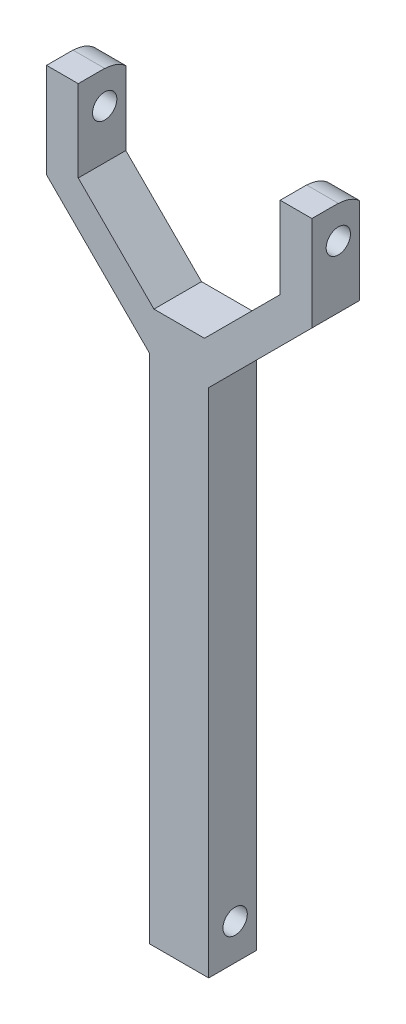
ISO-10303-21;
HEADER;
FILE_DESCRIPTION(('STEP AP214'),'2;1');
FILE_NAME('part.step','',(''),(''),'','','');
FILE_SCHEMA(('AUTOMOTIVE_DESIGN { 1 0 10303 214 1 1 1 1 }'));
ENDSEC;
DATA;
#1=APPLICATION_CONTEXT('core data for automotive mechanical design processes');
#2=APPLICATION_PROTOCOL_DEFINITION('international standard','automotive_design',2000,#1);
#3=PRODUCT_CONTEXT('',#1,'mechanical');
#4=PRODUCT('Part','Part','',(#3));
#5=PRODUCT_RELATED_PRODUCT_CATEGORY('part','',(#4));
#6=PRODUCT_DEFINITION_FORMATION('','',#4);
#7=PRODUCT_DEFINITION_CONTEXT('part definition',#1,'design');
#8=PRODUCT_DEFINITION('design','',#6,#7);
#9=PRODUCT_DEFINITION_SHAPE('','',#8);
#10=(LENGTH_UNIT() NAMED_UNIT(*) SI_UNIT(.MILLI.,.METRE.));
#11=(NAMED_UNIT(*) PLANE_ANGLE_UNIT() SI_UNIT($,.RADIAN.));
#12=(NAMED_UNIT(*) SI_UNIT($,.STERADIAN.) SOLID_ANGLE_UNIT());
#13=UNCERTAINTY_MEASURE_WITH_UNIT(LENGTH_MEASURE(1.E-05),#10,'distance_accuracy_value','');
#14=(GEOMETRIC_REPRESENTATION_CONTEXT(3) GLOBAL_UNCERTAINTY_ASSIGNED_CONTEXT((#13)) GLOBAL_UNIT_ASSIGNED_CONTEXT((#10,
#11,#12)) REPRESENTATION_CONTEXT('',''));
#15=CARTESIAN_POINT('',(0.,0.,0.));
#16=DIRECTION('',(0.,0.,1.));
#17=DIRECTION('',(1.,0.,0.));
#18=AXIS2_PLACEMENT_3D('',#15,#16,#17);
#19=CARTESIAN_POINT('',(11.6757149206511,24.7214625235345,4.5));
#20=DIRECTION('',(-1.,0.,0.));
#21=DIRECTION('',(0.,0.,1.));
#22=AXIS2_PLACEMENT_3D('',#19,#20,#21);
#23=PLANE('',#22);
#24=CARTESIAN_POINT('',(11.6757149206511,30.6105054346153,2.0000002331062));
#25=DIRECTION('',(-1.,0.,0.));
#26=DIRECTION('',(0.,0.,1.));
#27=AXIS2_PLACEMENT_3D('',#24,#25,#26);
#28=CIRCLE('',#27,1.15000000596049);
#29=CARTESIAN_POINT('',(11.6757149206511,30.6105054346153,3.15000023906669));
#30=VERTEX_POINT('',#29);
#31=EDGE_CURVE('E213',#30,#30,#28,.F.);
#32=ORIENTED_EDGE('',*,*,#31,.F.);
#33=EDGE_LOOP('',(#32));
#34=FACE_BOUND('',#33,.T.);
#35=CARTESIAN_POINT('',(11.6757149206511,30.6105054346153,2.00000023310621));
#36=DIRECTION('',(-1.,0.,0.));
#37=DIRECTION('',(0.,0.,1.));
#38=AXIS2_PLACEMENT_3D('',#35,#36,#37);
#39=CIRCLE('',#38,3.05476557348606);
#40=CARTESIAN_POINT('',(11.6757149206511,33.6652710081013,2.0000002331062));
#41=VERTEX_POINT('',#40);
#42=CARTESIAN_POINT('',(11.6757149206511,32.9195294224792,0.));
#43=VERTEX_POINT('',#42);
#44=EDGE_CURVE('E54',#41,#43,#39,.T.);
#45=ORIENTED_EDGE('',*,*,#44,.F.);
#46=DIRECTION('',(0.,-1.,0.));
#47=VECTOR('',#46,1.);
#48=CARTESIAN_POINT('',(11.6757149206511,24.7214625235345,2.0000002331062));
#49=LINE('',#48,#47);
#50=CARTESIAN_POINT('',(11.6757149206511,33.6923255947658,2.0000002331062));
#51=VERTEX_POINT('',#50);
#52=EDGE_CURVE('E165',#51,#41,#49,.T.);
#53=ORIENTED_EDGE('',*,*,#52,.F.);
#54=DIRECTION('',(0.,0.,-1.));
#55=VECTOR('',#54,1.);
#56=CARTESIAN_POINT('',(11.6757149206511,33.6923255947658,4.5));
#57=LINE('',#56,#55);
#58=CARTESIAN_POINT('',(11.6757149206511,33.6923255947658,4.5));
#59=VERTEX_POINT('',#58);
#60=EDGE_CURVE('E338',#59,#51,#57,.T.);
#61=ORIENTED_EDGE('',*,*,#60,.F.);
#62=DIRECTION('',(0.,1.,0.));
#63=VECTOR('',#62,1.);
#64=CARTESIAN_POINT('',(11.6757149206511,24.7214625235345,4.5));
#65=LINE('',#64,#63);
#66=CARTESIAN_POINT('',(11.6757149206511,24.7214625235345,4.5));
#67=VERTEX_POINT('',#66);
#68=EDGE_CURVE('E237',#67,#59,#65,.T.);
#69=ORIENTED_EDGE('',*,*,#68,.F.);
#70=DIRECTION('',(0.,0.,-1.));
#71=VECTOR('',#70,1.);
#72=CARTESIAN_POINT('',(11.6757149206511,24.7214625235345,4.5));
#73=LINE('',#72,#71);
#74=CARTESIAN_POINT('',(11.6757149206511,24.7214625235345,0.));
#75=VERTEX_POINT('',#74);
#76=EDGE_CURVE('E341',#67,#75,#73,.T.);
#77=ORIENTED_EDGE('',*,*,#76,.T.);
#78=DIRECTION('',(0.,1.,0.));
#79=VECTOR('',#78,1.);
#80=CARTESIAN_POINT('',(11.6757149206511,24.7214625235345,0.));
#81=LINE('',#80,#79);
#82=EDGE_CURVE('E187',#75,#43,#81,.T.);
#83=ORIENTED_EDGE('',*,*,#82,.T.);
#84=EDGE_LOOP('',(#45,#53,#61,#69,#77,#83));
#85=FACE_BOUND('',#84,.T.);
#86=ADVANCED_FACE('F38',(#34,#85),#23,.F.);
#87=CARTESIAN_POINT('',(11.6757149206511,33.6923255947658,4.5));
#88=DIRECTION('',(0.,-1.,0.));
#89=DIRECTION('',(0.,0.,-1.));
#90=AXIS2_PLACEMENT_3D('',#87,#88,#89);
#91=PLANE('',#90);
#92=DIRECTION('',(1.,0.,0.));
#93=VECTOR('',#92,1.);
#94=CARTESIAN_POINT('',(11.6757149206511,33.6923255947658,2.0000002331062));
#95=LINE('',#94,#93);
#96=CARTESIAN_POINT('',(8.67571399961199,33.6923255947658,2.0000002331062));
#97=VERTEX_POINT('',#96);
#98=EDGE_CURVE('E170',#97,#51,#95,.T.);
#99=ORIENTED_EDGE('',*,*,#98,.F.);
#100=DIRECTION('',(0.,0.,-1.));
#101=VECTOR('',#100,1.);
#102=CARTESIAN_POINT('',(8.67571399961199,33.6923255947658,4.5));
#103=LINE('',#102,#101);
#104=CARTESIAN_POINT('',(8.67571399961199,33.6923255947658,4.5));
#105=VERTEX_POINT('',#104);
#106=EDGE_CURVE('E334',#105,#97,#103,.T.);
#107=ORIENTED_EDGE('',*,*,#106,.F.);
#108=DIRECTION('',(-1.,0.,0.));
#109=VECTOR('',#108,1.);
#110=CARTESIAN_POINT('',(11.6757149206511,33.6923255947658,4.5));
#111=LINE('',#110,#109);
#112=EDGE_CURVE('E240',#59,#105,#111,.T.);
#113=ORIENTED_EDGE('',*,*,#112,.F.);
#114=ORIENTED_EDGE('',*,*,#60,.T.);
#115=EDGE_LOOP('',(#99,#107,#113,#114));
#116=FACE_BOUND('',#115,.T.);
#117=ADVANCED_FACE('F390',(#116),#91,.F.);
#118=CARTESIAN_POINT('',(8.67571399961199,33.6923255947658,4.5));
#119=DIRECTION('',(1.,0.,0.));
#120=DIRECTION('',(0.,0.,-1.));
#121=AXIS2_PLACEMENT_3D('',#118,#119,#120);
#122=PLANE('',#121);
#123=CARTESIAN_POINT('',(8.67571399961199,30.6105054346153,2.0000002331062));
#124=DIRECTION('',(1.,0.,0.));
#125=DIRECTION('',(0.,0.,-1.));
#126=AXIS2_PLACEMENT_3D('',#123,#124,#125);
#127=CIRCLE('',#126,1.15000000596049);
#128=CARTESIAN_POINT('',(8.67571399961199,30.6105054346153,0.850000227145715));
#129=VERTEX_POINT('',#128);
#130=EDGE_CURVE('E209',#129,#129,#127,.F.);
#131=ORIENTED_EDGE('',*,*,#130,.F.);
#132=EDGE_LOOP('',(#131));
#133=FACE_BOUND('',#132,.T.);
#134=CARTESIAN_POINT('',(8.67571399961199,30.6105054346153,2.00000023310621));
#135=DIRECTION('',(1.,0.,0.));
#136=DIRECTION('',(0.,0.,-1.));
#137=AXIS2_PLACEMENT_3D('',#134,#135,#136);
#138=CIRCLE('',#137,3.05476557348606);
#139=CARTESIAN_POINT('',(8.67571399961199,32.9195294224792,0.));
#140=VERTEX_POINT('',#139);
#141=CARTESIAN_POINT('',(8.67571399961199,33.6652710081013,2.0000002331062));
#142=VERTEX_POINT('',#141);
#143=EDGE_CURVE('E179',#140,#142,#138,.T.);
#144=ORIENTED_EDGE('',*,*,#143,.F.);
#145=DIRECTION('',(0.,-1.,0.));
#146=VECTOR('',#145,1.);
#147=CARTESIAN_POINT('',(8.67571399961199,33.6923255947658,0.));
#148=LINE('',#147,#146);
#149=CARTESIAN_POINT('',(8.67571399961199,25.9641041782924,0.));
#150=VERTEX_POINT('',#149);
#151=EDGE_CURVE('E282',#140,#150,#148,.T.);
#152=ORIENTED_EDGE('',*,*,#151,.T.);
#153=DIRECTION('',(0.,0.,-1.));
#154=VECTOR('',#153,1.);
#155=CARTESIAN_POINT('',(8.67571399961199,25.9641041782924,4.5));
#156=LINE('',#155,#154);
#157=CARTESIAN_POINT('',(8.67571399961199,25.9641041782924,4.5));
#158=VERTEX_POINT('',#157);
#159=EDGE_CURVE('E330',#158,#150,#156,.T.);
#160=ORIENTED_EDGE('',*,*,#159,.F.);
#161=DIRECTION('',(0.,-1.,0.));
#162=VECTOR('',#161,1.);
#163=CARTESIAN_POINT('',(8.67571399961199,33.6923255947658,4.5));
#164=LINE('',#163,#162);
#165=EDGE_CURVE('E243',#105,#158,#164,.T.);
#166=ORIENTED_EDGE('',*,*,#165,.F.);
#167=ORIENTED_EDGE('',*,*,#106,.T.);
#168=DIRECTION('',(0.,1.,0.));
#169=VECTOR('',#168,1.);
#170=CARTESIAN_POINT('',(8.67571399961199,33.6923255947658,2.0000002331062));
#171=LINE('',#170,#169);
#172=EDGE_CURVE('E200',#142,#97,#171,.T.);
#173=ORIENTED_EDGE('',*,*,#172,.F.);
#174=EDGE_LOOP('',(#144,#152,#160,#166,#167,#173));
#175=FACE_BOUND('',#174,.T.);
#176=ADVANCED_FACE('F368',(#133,#175),#122,.F.);
#177=CARTESIAN_POINT('',(-10.4242849513463,25.9641046551296,4.5));
#178=DIRECTION('',(-1.,0.,0.));
#179=DIRECTION('',(0.,0.,1.));
#180=AXIS2_PLACEMENT_3D('',#177,#178,#179);
#181=PLANE('',#180);
#182=CARTESIAN_POINT('',(-10.4242849513463,30.6105054346153,2.0000002331062));
#183=DIRECTION('',(-1.,0.,0.));
#184=DIRECTION('',(0.,0.,1.));
#185=AXIS2_PLACEMENT_3D('',#182,#183,#184);
#186=CIRCLE('',#185,1.15000000596049);
#187=CARTESIAN_POINT('',(-10.4242849513463,30.6105054346153,3.15000023906669));
#188=VERTEX_POINT('',#187);
#189=EDGE_CURVE('E205',#188,#188,#186,.F.);
#190=ORIENTED_EDGE('',*,*,#189,.F.);
#191=EDGE_LOOP('',(#190));
#192=FACE_BOUND('',#191,.T.);
#193=CARTESIAN_POINT('',(-10.4242849513463,30.6105054346153,2.00000023310621));
#194=DIRECTION('',(-1.,0.,0.));
#195=DIRECTION('',(0.,0.,1.));
#196=AXIS2_PLACEMENT_3D('',#193,#194,#195);
#197=CIRCLE('',#196,3.05476557348606);
#198=CARTESIAN_POINT('',(-10.4242849513463,33.6652710081013,2.0000002331062));
#199=VERTEX_POINT('',#198);
#200=CARTESIAN_POINT('',(-10.4242849513463,32.9195294224792,0.));
#201=VERTEX_POINT('',#200);
#202=EDGE_CURVE('E62',#199,#201,#197,.T.);
#203=ORIENTED_EDGE('',*,*,#202,.F.);
#204=DIRECTION('',(0.,-1.,0.));
#205=VECTOR('',#204,1.);
#206=CARTESIAN_POINT('',(-10.4242849513463,25.9641046551296,2.0000002331062));
#207=LINE('',#206,#205);
#208=CARTESIAN_POINT('',(-10.4242849513463,33.692326071603,2.0000002331062));
#209=VERTEX_POINT('',#208);
#210=EDGE_CURVE('E193',#209,#199,#207,.T.);
#211=ORIENTED_EDGE('',*,*,#210,.F.);
#212=DIRECTION('',(0.,0.,-1.));
#213=VECTOR('',#212,1.);
#214=CARTESIAN_POINT('',(-10.4242849513463,33.692326071603,4.5));
#215=LINE('',#214,#213);
#216=CARTESIAN_POINT('',(-10.4242849513463,33.692326071603,4.5));
#217=VERTEX_POINT('',#216);
#218=EDGE_CURVE('E314',#217,#209,#215,.T.);
#219=ORIENTED_EDGE('',*,*,#218,.F.);
#220=DIRECTION('',(0.,1.,0.));
#221=VECTOR('',#220,1.);
#222=CARTESIAN_POINT('',(-10.4242849513463,25.9641046551296,4.5));
#223=LINE('',#222,#221);
#224=CARTESIAN_POINT('',(-10.4242849513463,25.9641046551296,4.5));
#225=VERTEX_POINT('',#224);
#226=EDGE_CURVE('E255',#225,#217,#223,.T.);
#227=ORIENTED_EDGE('',*,*,#226,.F.);
#228=DIRECTION('',(0.,0.,-1.));
#229=VECTOR('',#228,1.);
#230=CARTESIAN_POINT('',(-10.4242849513463,25.9641046551296,4.5));
#231=LINE('',#230,#229);
#232=CARTESIAN_POINT('',(-10.4242849513463,25.9641046551296,0.));
#233=VERTEX_POINT('',#232);
#234=EDGE_CURVE('E318',#225,#233,#231,.T.);
#235=ORIENTED_EDGE('',*,*,#234,.T.);
#236=DIRECTION('',(0.,1.,0.));
#237=VECTOR('',#236,1.);
#238=CARTESIAN_POINT('',(-10.4242849513463,25.9641046551296,0.));
#239=LINE('',#238,#237);
#240=EDGE_CURVE('E294',#233,#201,#239,.T.);
#241=ORIENTED_EDGE('',*,*,#240,.T.);
#242=EDGE_LOOP('',(#203,#211,#219,#227,#235,#241));
#243=FACE_BOUND('',#242,.T.);
#244=ADVANCED_FACE('F431',(#192,#243),#181,.F.);
#245=CARTESIAN_POINT('',(-10.4242849513463,33.692326071603,4.5));
#246=DIRECTION('',(0.,-1.,0.));
#247=DIRECTION('',(0.,0.,-1.));
#248=AXIS2_PLACEMENT_3D('',#245,#246,#247);
#249=PLANE('',#248);
#250=DIRECTION('',(1.,0.,0.));
#251=VECTOR('',#250,1.);
#252=CARTESIAN_POINT('',(-10.4242849513463,33.692326071603,2.0000002331062));
#253=LINE('',#252,#251);
#254=CARTESIAN_POINT('',(-13.4242849513463,33.692326071603,2.0000002331062));
#255=VERTEX_POINT('',#254);
#256=EDGE_CURVE('E189',#255,#209,#253,.T.);
#257=ORIENTED_EDGE('',*,*,#256,.F.);
#258=DIRECTION('',(0.,0.,-1.));
#259=VECTOR('',#258,1.);
#260=CARTESIAN_POINT('',(-13.4242849513463,33.692326071603,4.5));
#261=LINE('',#260,#259);
#262=CARTESIAN_POINT('',(-13.4242849513463,33.692326071603,4.5));
#263=VERTEX_POINT('',#262);
#264=EDGE_CURVE('E310',#263,#255,#261,.T.);
#265=ORIENTED_EDGE('',*,*,#264,.F.);
#266=DIRECTION('',(-1.,0.,0.));
#267=VECTOR('',#266,1.);
#268=CARTESIAN_POINT('',(-10.4242849513463,33.692326071603,4.5));
#269=LINE('',#268,#267);
#270=EDGE_CURVE('E258',#217,#263,#269,.T.);
#271=ORIENTED_EDGE('',*,*,#270,.F.);
#272=ORIENTED_EDGE('',*,*,#218,.T.);
#273=EDGE_LOOP('',(#257,#265,#271,#272));
#274=FACE_BOUND('',#273,.T.);
#275=ADVANCED_FACE('F440',(#274),#249,.F.);
#276=CARTESIAN_POINT('',(-13.4242849513463,33.692326071603,4.5));
#277=DIRECTION('',(1.,0.,0.));
#278=DIRECTION('',(0.,0.,-1.));
#279=AXIS2_PLACEMENT_3D('',#276,#277,#278);
#280=PLANE('',#279);
#281=CARTESIAN_POINT('',(-13.4242849513463,30.6105054346153,2.0000002331062));
#282=DIRECTION('',(1.,0.,0.));
#283=DIRECTION('',(0.,0.,-1.));
#284=AXIS2_PLACEMENT_3D('',#281,#282,#283);
#285=CIRCLE('',#284,1.15000000596049);
#286=CARTESIAN_POINT('',(-13.4242849513463,30.6105054346153,0.850000227145715));
#287=VERTEX_POINT('',#286);
#288=EDGE_CURVE('E175',#287,#287,#285,.F.);
#289=ORIENTED_EDGE('',*,*,#288,.F.);
#290=EDGE_LOOP('',(#289));
#291=FACE_BOUND('',#290,.T.);
#292=CARTESIAN_POINT('',(-13.4242849513463,30.6105054346153,2.00000023310621));
#293=DIRECTION('',(1.,0.,0.));
#294=DIRECTION('',(0.,0.,-1.));
#295=AXIS2_PLACEMENT_3D('',#292,#293,#294);
#296=CIRCLE('',#295,3.05476557348606);
#297=CARTESIAN_POINT('',(-13.4242849513463,32.9195294224792,0.));
#298=VERTEX_POINT('',#297);
#299=CARTESIAN_POINT('',(-13.4242849513463,33.6652710081013,2.0000002331062));
#300=VERTEX_POINT('',#299);
#301=EDGE_CURVE('E181',#298,#300,#296,.T.);
#302=ORIENTED_EDGE('',*,*,#301,.F.);
#303=DIRECTION('',(0.,-1.,0.));
#304=VECTOR('',#303,1.);
#305=CARTESIAN_POINT('',(-13.4242849513463,33.692326071603,0.));
#306=LINE('',#305,#304);
#307=CARTESIAN_POINT('',(-13.4242849513463,24.7214639214107,0.));
#308=VERTEX_POINT('',#307);
#309=EDGE_CURVE('E298',#298,#308,#306,.T.);
#310=ORIENTED_EDGE('',*,*,#309,.T.);
#311=DIRECTION('',(0.,0.,-1.));
#312=VECTOR('',#311,1.);
#313=CARTESIAN_POINT('',(-13.4242849513463,24.7214639214107,4.5));
#314=LINE('',#313,#312);
#315=CARTESIAN_POINT('',(-13.4242849513463,24.7214639214107,4.5));
#316=VERTEX_POINT('',#315);
#317=EDGE_CURVE('E306',#316,#308,#314,.T.);
#318=ORIENTED_EDGE('',*,*,#317,.F.);
#319=DIRECTION('',(0.,-1.,0.));
#320=VECTOR('',#319,1.);
#321=CARTESIAN_POINT('',(-13.4242849513463,33.692326071603,4.5));
#322=LINE('',#321,#320);
#323=EDGE_CURVE('E261',#263,#316,#322,.T.);
#324=ORIENTED_EDGE('',*,*,#323,.F.);
#325=ORIENTED_EDGE('',*,*,#264,.T.);
#326=DIRECTION('',(0.,1.,0.));
#327=VECTOR('',#326,1.);
#328=CARTESIAN_POINT('',(-13.4242849513463,33.692326071603,2.0000002331062));
#329=LINE('',#328,#327);
#330=EDGE_CURVE('E11',#300,#255,#329,.T.);
#331=ORIENTED_EDGE('',*,*,#330,.F.);
#332=EDGE_LOOP('',(#302,#310,#318,#324,#325,#331));
#333=FACE_BOUND('',#332,.T.);
#334=ADVANCED_FACE('F418',(#291,#333),#280,.F.);
#335=CARTESIAN_POINT('',(0.,0.,0.));
#336=DIRECTION('',(0.,0.,1.));
#337=DIRECTION('',(1.,0.,0.));
#338=AXIS2_PLACEMENT_3D('',#335,#336,#337);
#339=PLANE('',#338);
#340=DIRECTION('',(-1.,0.,0.));
#341=VECTOR('',#340,1.);
#342=CARTESIAN_POINT('',(89.5757150486537,32.9195294224792,0.));
#343=LINE('',#342,#341);
#344=EDGE_CURVE('E47',#43,#140,#343,.T.);
#345=ORIENTED_EDGE('',*,*,#344,.F.);
#346=ORIENTED_EDGE('',*,*,#82,.F.);
#347=DIRECTION('',(0.70710680472935,0.707106757643745,0.));
#348=VECTOR('',#347,1.);
#349=CARTESIAN_POINT('',(1.91457842145647,14.9603266743251,0.));
#350=LINE('',#349,#348);
#351=CARTESIAN_POINT('',(1.91457842145647,14.9603266743251,0.));
#352=VERTEX_POINT('',#351);
#353=EDGE_CURVE('E277',#352,#75,#350,.T.);
#354=ORIENTED_EDGE('',*,*,#353,.F.);
#355=DIRECTION('',(0.,1.,0.));
#356=VECTOR('',#355,1.);
#357=CARTESIAN_POINT('',(1.91457842145647,-33.4008975001744,0.));
#358=LINE('',#357,#356);
#359=CARTESIAN_POINT('',(1.91457842145647,-33.4008975001744,0.));
#360=VERTEX_POINT('',#359);
#361=EDGE_CURVE('E274',#360,#352,#358,.T.);
#362=ORIENTED_EDGE('',*,*,#361,.F.);
#363=DIRECTION('',(1.,0.,0.));
#364=VECTOR('',#363,1.);
#365=CARTESIAN_POINT('',(-3.66314794267927,-33.4008975001744,0.));
#366=LINE('',#365,#364);
#367=CARTESIAN_POINT('',(-3.66314794267927,-33.4008975001744,0.));
#368=VERTEX_POINT('',#367);
#369=EDGE_CURVE('E271',#368,#360,#366,.T.);
#370=ORIENTED_EDGE('',*,*,#369,.F.);
#371=DIRECTION('',(0.,-1.,0.));
#372=VECTOR('',#371,1.);
#373=CARTESIAN_POINT('',(-3.66314794267927,14.9603266743251,0.));
#374=LINE('',#373,#372);
#375=CARTESIAN_POINT('',(-3.66314794267927,14.9603266743251,0.));
#376=VERTEX_POINT('',#375);
#377=EDGE_CURVE('E222',#376,#368,#374,.T.);
#378=ORIENTED_EDGE('',*,*,#377,.F.);
#379=DIRECTION('',(0.707106772550904,-0.707106789822191,0.));
#380=VECTOR('',#379,1.);
#381=CARTESIAN_POINT('',(-13.4242849513463,24.7214639214107,0.));
#382=LINE('',#381,#380);
#383=EDGE_CURVE('E228',#308,#376,#382,.T.);
#384=ORIENTED_EDGE('',*,*,#383,.F.);
#385=ORIENTED_EDGE('',*,*,#309,.F.);
#386=EDGE_CURVE('E356',#201,#298,#343,.T.);
#387=ORIENTED_EDGE('',*,*,#386,.F.);
#388=ORIENTED_EDGE('',*,*,#240,.F.);
#389=DIRECTION('',(-0.707106757643745,0.70710680472935,0.));
#390=VECTOR('',#389,1.);
#391=CARTESIAN_POINT('',(-3.26339627947126,18.8032155064174,0.));
#392=LINE('',#391,#390);
#393=CARTESIAN_POINT('',(-3.26339627947126,18.8032155064174,0.));
#394=VERTEX_POINT('',#393);
#395=EDGE_CURVE('E291',#394,#233,#392,.T.);
#396=ORIENTED_EDGE('',*,*,#395,.F.);
#397=DIRECTION('',(-1.,0.,0.));
#398=VECTOR('',#397,1.);
#399=CARTESIAN_POINT('',(1.51482485089983,18.8032155064174,0.));
#400=LINE('',#399,#398);
#401=CARTESIAN_POINT('',(1.51482485089983,18.8032155064174,0.));
#402=VERTEX_POINT('',#401);
#403=EDGE_CURVE('E288',#402,#394,#400,.T.);
#404=ORIENTED_EDGE('',*,*,#403,.F.);
#405=DIRECTION('',(-0.70710680472935,-0.707106757643745,0.));
#406=VECTOR('',#405,1.);
#407=CARTESIAN_POINT('',(8.67571399961199,25.9641041782924,0.));
#408=LINE('',#407,#406);
#409=EDGE_CURVE('E285',#150,#402,#408,.T.);
#410=ORIENTED_EDGE('',*,*,#409,.F.);
#411=ORIENTED_EDGE('',*,*,#151,.F.);
#412=EDGE_LOOP('',(#345,#346,#354,#362,#370,#378,#384,#385,#387,#388,#396,#404,#410,#411));
#413=FACE_BOUND('',#412,.T.);
#414=ADVANCED_FACE('F371',(#413),#339,.F.);
#415=CARTESIAN_POINT('',(-3.66314794267927,14.9603266743251,4.5));
#416=DIRECTION('',(1.,0.,0.));
#417=DIRECTION('',(0.,0.,-1.));
#418=AXIS2_PLACEMENT_3D('',#415,#416,#417);
#419=PLANE('',#418);
#420=CARTESIAN_POINT('',(-3.66314794267927,-29.9935288634835,2.00000072337778));
#421=DIRECTION('',(1.,0.,0.));
#422=DIRECTION('',(0.,0.,-1.));
#423=AXIS2_PLACEMENT_3D('',#420,#421,#422);
#424=CIRCLE('',#423,1.15000059548713);
#425=CARTESIAN_POINT('',(-3.66314794267927,-29.9935288634835,0.850000127890653));
#426=VERTEX_POINT('',#425);
#427=EDGE_CURVE('E218',#426,#426,#424,.F.);
#428=ORIENTED_EDGE('',*,*,#427,.F.);
#429=EDGE_LOOP('',(#428));
#430=FACE_BOUND('',#429,.T.);
#431=ORIENTED_EDGE('',*,*,#377,.T.);
#432=DIRECTION('',(0.,0.,-1.));
#433=VECTOR('',#432,1.);
#434=CARTESIAN_POINT('',(-3.66314794267927,-33.4008975001744,4.5));
#435=LINE('',#434,#433);
#436=CARTESIAN_POINT('',(-3.66314794267927,-33.4008975001744,4.5));
#437=VERTEX_POINT('',#436);
#438=EDGE_CURVE('E352',#437,#368,#435,.T.);
#439=ORIENTED_EDGE('',*,*,#438,.F.);
#440=DIRECTION('',(0.,-1.,0.));
#441=VECTOR('',#440,1.);
#442=CARTESIAN_POINT('',(-3.66314794267927,14.9603266743251,4.5));
#443=LINE('',#442,#441);
#444=CARTESIAN_POINT('',(-3.66314794267927,14.9603266743251,4.5));
#445=VERTEX_POINT('',#444);
#446=EDGE_CURVE('E223',#445,#437,#443,.T.);
#447=ORIENTED_EDGE('',*,*,#446,.F.);
#448=DIRECTION('',(0.,0.,-1.));
#449=VECTOR('',#448,1.);
#450=CARTESIAN_POINT('',(-3.66314794267927,14.9603266743251,4.5));
#451=LINE('',#450,#449);
#452=EDGE_CURVE('E267',#445,#376,#451,.T.);
#453=ORIENTED_EDGE('',*,*,#452,.T.);
#454=EDGE_LOOP('',(#431,#439,#447,#453));
#455=FACE_BOUND('',#454,.T.);
#456=ADVANCED_FACE('F40',(#430,#455),#419,.F.);
#457=CARTESIAN_POINT('',(-3.66314794267927,-33.4008975001744,4.5));
#458=DIRECTION('',(0.,1.,0.));
#459=DIRECTION('',(0.,0.,1.));
#460=AXIS2_PLACEMENT_3D('',#457,#458,#459);
#461=PLANE('',#460);
#462=ORIENTED_EDGE('',*,*,#369,.T.);
#463=DIRECTION('',(0.,0.,-1.));
#464=VECTOR('',#463,1.);
#465=CARTESIAN_POINT('',(1.91457842145647,-33.4008975001744,4.5));
#466=LINE('',#465,#464);
#467=CARTESIAN_POINT('',(1.91457842145647,-33.4008975001744,4.5));
#468=VERTEX_POINT('',#467);
#469=EDGE_CURVE('E348',#468,#360,#466,.T.);
#470=ORIENTED_EDGE('',*,*,#469,.F.);
#471=DIRECTION('',(1.,0.,0.));
#472=VECTOR('',#471,1.);
#473=CARTESIAN_POINT('',(-3.66314794267927,-33.4008975001744,4.5));
#474=LINE('',#473,#472);
#475=EDGE_CURVE('E227',#437,#468,#474,.T.);
#476=ORIENTED_EDGE('',*,*,#475,.F.);
#477=ORIENTED_EDGE('',*,*,#438,.T.);
#478=EDGE_LOOP('',(#462,#470,#476,#477));
#479=FACE_BOUND('',#478,.T.);
#480=ADVANCED_FACE('F405',(#479),#461,.F.);
#481=CARTESIAN_POINT('',(1.91457842145647,-33.4008975001744,4.5));
#482=DIRECTION('',(-1.,0.,0.));
#483=DIRECTION('',(0.,0.,1.));
#484=AXIS2_PLACEMENT_3D('',#481,#482,#483);
#485=PLANE('',#484);
#486=CARTESIAN_POINT('',(1.91457842145648,-29.9935288634835,2.00000072337778));
#487=DIRECTION('',(-1.,0.,0.));
#488=DIRECTION('',(0.,0.,1.));
#489=AXIS2_PLACEMENT_3D('',#486,#487,#488);
#490=CIRCLE('',#489,1.15000059548713);
#491=CARTESIAN_POINT('',(1.91457842145648,-29.9935288634835,3.15000131886491));
#492=VERTEX_POINT('',#491);
#493=EDGE_CURVE('E217',#492,#492,#490,.F.);
#494=ORIENTED_EDGE('',*,*,#493,.F.);
#495=EDGE_LOOP('',(#494));
#496=FACE_BOUND('',#495,.T.);
#497=ORIENTED_EDGE('',*,*,#361,.T.);
#498=DIRECTION('',(0.,0.,-1.));
#499=VECTOR('',#498,1.);
#500=CARTESIAN_POINT('',(1.91457842145647,14.9603266743251,4.5));
#501=LINE('',#500,#499);
#502=CARTESIAN_POINT('',(1.91457842145647,14.9603266743251,4.5));
#503=VERTEX_POINT('',#502);
#504=EDGE_CURVE('E344',#503,#352,#501,.T.);
#505=ORIENTED_EDGE('',*,*,#504,.F.);
#506=DIRECTION('',(0.,1.,0.));
#507=VECTOR('',#506,1.);
#508=CARTESIAN_POINT('',(1.91457842145647,-33.4008975001744,4.5));
#509=LINE('',#508,#507);
#510=EDGE_CURVE('E231',#468,#503,#509,.T.);
#511=ORIENTED_EDGE('',*,*,#510,.F.);
#512=ORIENTED_EDGE('',*,*,#469,.T.);
#513=EDGE_LOOP('',(#497,#505,#511,#512));
#514=FACE_BOUND('',#513,.T.);
#515=ADVANCED_FACE('F402',(#496,#514),#485,.F.);
#516=CARTESIAN_POINT('',(1.91457842145647,14.9603266743251,4.5));
#517=DIRECTION('',(-0.707106757643745,0.70710680472935,0.));
#518=DIRECTION('',(-0.70710680472935,-0.707106757643745,0.));
#519=AXIS2_PLACEMENT_3D('',#516,#517,#518);
#520=PLANE('',#519);
#521=ORIENTED_EDGE('',*,*,#353,.T.);
#522=ORIENTED_EDGE('',*,*,#76,.F.);
#523=DIRECTION('',(0.70710680472935,0.707106757643745,0.));
#524=VECTOR('',#523,1.);
#525=CARTESIAN_POINT('',(1.91457842145647,14.9603266743251,4.5));
#526=LINE('',#525,#524);
#527=EDGE_CURVE('E234',#503,#67,#526,.T.);
#528=ORIENTED_EDGE('',*,*,#527,.F.);
#529=ORIENTED_EDGE('',*,*,#504,.T.);
#530=EDGE_LOOP('',(#521,#522,#528,#529));
#531=FACE_BOUND('',#530,.T.);
#532=ADVANCED_FACE('F397',(#531),#520,.F.);
#533=CARTESIAN_POINT('',(8.67571399961199,25.9641041782924,4.5));
#534=DIRECTION('',(0.707106757643745,-0.70710680472935,0.));
#535=DIRECTION('',(0.70710680472935,0.707106757643745,0.));
#536=AXIS2_PLACEMENT_3D('',#533,#534,#535);
#537=PLANE('',#536);
#538=ORIENTED_EDGE('',*,*,#409,.T.);
#539=DIRECTION('',(0.,0.,-1.));
#540=VECTOR('',#539,1.);
#541=CARTESIAN_POINT('',(1.51482485089983,18.8032155064174,4.5));
#542=LINE('',#541,#540);
#543=CARTESIAN_POINT('',(1.51482485089983,18.8032155064174,4.5));
#544=VERTEX_POINT('',#543);
#545=EDGE_CURVE('E326',#544,#402,#542,.T.);
#546=ORIENTED_EDGE('',*,*,#545,.F.);
#547=DIRECTION('',(-0.70710680472935,-0.707106757643745,0.));
#548=VECTOR('',#547,1.);
#549=CARTESIAN_POINT('',(8.67571399961199,25.9641041782924,4.5));
#550=LINE('',#549,#548);
#551=EDGE_CURVE('E246',#158,#544,#550,.T.);
#552=ORIENTED_EDGE('',*,*,#551,.F.);
#553=ORIENTED_EDGE('',*,*,#159,.T.);
#554=EDGE_LOOP('',(#538,#546,#552,#553));
#555=FACE_BOUND('',#554,.T.);
#556=ADVANCED_FACE('F376',(#555),#537,.F.);
#557=CARTESIAN_POINT('',(1.51482485089983,18.8032155064174,4.5));
#558=DIRECTION('',(0.,-1.,0.));
#559=DIRECTION('',(0.,0.,-1.));
#560=AXIS2_PLACEMENT_3D('',#557,#558,#559);
#561=PLANE('',#560);
#562=ORIENTED_EDGE('',*,*,#403,.T.);
#563=DIRECTION('',(0.,0.,-1.));
#564=VECTOR('',#563,1.);
#565=CARTESIAN_POINT('',(-3.26339627947126,18.8032155064174,4.5));
#566=LINE('',#565,#564);
#567=CARTESIAN_POINT('',(-3.26339627947126,18.8032155064174,4.5));
#568=VERTEX_POINT('',#567);
#569=EDGE_CURVE('E322',#568,#394,#566,.T.);
#570=ORIENTED_EDGE('',*,*,#569,.F.);
#571=DIRECTION('',(-1.,0.,0.));
#572=VECTOR('',#571,1.);
#573=CARTESIAN_POINT('',(1.51482485089983,18.8032155064174,4.5));
#574=LINE('',#573,#572);
#575=EDGE_CURVE('E249',#544,#568,#574,.T.);
#576=ORIENTED_EDGE('',*,*,#575,.F.);
#577=ORIENTED_EDGE('',*,*,#545,.T.);
#578=EDGE_LOOP('',(#562,#570,#576,#577));
#579=FACE_BOUND('',#578,.T.);
#580=ADVANCED_FACE('F380',(#579),#561,.F.);
#581=CARTESIAN_POINT('',(-3.26339627947126,18.8032155064174,4.5));
#582=DIRECTION('',(-0.70710680472935,-0.707106757643745,0.));
#583=DIRECTION('',(0.707106757643745,-0.70710680472935,0.));
#584=AXIS2_PLACEMENT_3D('',#581,#582,#583);
#585=PLANE('',#584);
#586=ORIENTED_EDGE('',*,*,#395,.T.);
#587=ORIENTED_EDGE('',*,*,#234,.F.);
#588=DIRECTION('',(-0.707106757643745,0.70710680472935,0.));
#589=VECTOR('',#588,1.);
#590=CARTESIAN_POINT('',(-3.26339627947126,18.8032155064174,4.5));
#591=LINE('',#590,#589);
#592=EDGE_CURVE('E252',#568,#225,#591,.T.);
#593=ORIENTED_EDGE('',*,*,#592,.F.);
#594=ORIENTED_EDGE('',*,*,#569,.T.);
#595=EDGE_LOOP('',(#586,#587,#593,#594));
#596=FACE_BOUND('',#595,.T.);
#597=ADVANCED_FACE('F436',(#596),#585,.F.);
#598=CARTESIAN_POINT('',(-13.4242849513463,24.7214639214107,4.5));
#599=DIRECTION('',(0.707106789822191,0.707106772550904,0.));
#600=DIRECTION('',(-0.707106772550904,0.707106789822191,0.));
#601=AXIS2_PLACEMENT_3D('',#598,#599,#600);
#602=PLANE('',#601);
#603=ORIENTED_EDGE('',*,*,#383,.T.);
#604=ORIENTED_EDGE('',*,*,#452,.F.);
#605=DIRECTION('',(0.707106772550904,-0.707106789822191,0.));
#606=VECTOR('',#605,1.);
#607=CARTESIAN_POINT('',(-13.4242849513463,24.7214639214107,4.5));
#608=LINE('',#607,#606);
#609=EDGE_CURVE('E264',#316,#445,#608,.T.);
#610=ORIENTED_EDGE('',*,*,#609,.F.);
#611=ORIENTED_EDGE('',*,*,#317,.T.);
#612=EDGE_LOOP('',(#603,#604,#610,#611));
#613=FACE_BOUND('',#612,.T.);
#614=ADVANCED_FACE('F413',(#613),#602,.F.);
#615=CARTESIAN_POINT('',(0.,0.,4.5));
#616=DIRECTION('',(0.,0.,1.));
#617=DIRECTION('',(1.,0.,0.));
#618=AXIS2_PLACEMENT_3D('',#615,#616,#617);
#619=PLANE('',#618);
#620=ORIENTED_EDGE('',*,*,#446,.T.);
#621=ORIENTED_EDGE('',*,*,#475,.T.);
#622=ORIENTED_EDGE('',*,*,#510,.T.);
#623=ORIENTED_EDGE('',*,*,#527,.T.);
#624=ORIENTED_EDGE('',*,*,#68,.T.);
#625=ORIENTED_EDGE('',*,*,#112,.T.);
#626=ORIENTED_EDGE('',*,*,#165,.T.);
#627=ORIENTED_EDGE('',*,*,#551,.T.);
#628=ORIENTED_EDGE('',*,*,#575,.T.);
#629=ORIENTED_EDGE('',*,*,#592,.T.);
#630=ORIENTED_EDGE('',*,*,#226,.T.);
#631=ORIENTED_EDGE('',*,*,#270,.T.);
#632=ORIENTED_EDGE('',*,*,#323,.T.);
#633=ORIENTED_EDGE('',*,*,#609,.T.);
#634=EDGE_LOOP('',(#620,#621,#622,#623,#624,#625,#626,#627,#628,#629,#630,#631,#632,#633));
#635=FACE_BOUND('',#634,.T.);
#636=ADVANCED_FACE('F384',(#635),#619,.T.);
#637=CARTESIAN_POINT('',(100.,30.6105054346153,2.0000002331062));
#638=DIRECTION('',(-1.,0.,0.));
#639=DIRECTION('',(0.,0.,1.));
#640=AXIS2_PLACEMENT_3D('',#637,#638,#639);
#641=CYLINDRICAL_SURFACE('',#640,1.15000000596049);
#642=ORIENTED_EDGE('',*,*,#288,.T.);
#643=EDGE_LOOP('',(#642));
#644=FACE_BOUND('',#643,.T.);
#645=ORIENTED_EDGE('',*,*,#189,.T.);
#646=EDGE_LOOP('',(#645));
#647=FACE_BOUND('',#646,.T.);
#648=ADVANCED_FACE('F487',(#644,#647),#641,.F.);
#649=ORIENTED_EDGE('',*,*,#130,.T.);
#650=EDGE_LOOP('',(#649));
#651=FACE_BOUND('',#650,.T.);
#652=ORIENTED_EDGE('',*,*,#31,.T.);
#653=EDGE_LOOP('',(#652));
#654=FACE_BOUND('',#653,.T.);
#655=ADVANCED_FACE('F479',(#651,#654),#641,.F.);
#656=CARTESIAN_POINT('',(100.,-29.9935288634835,2.00000072337778));
#657=DIRECTION('',(-1.,0.,0.));
#658=DIRECTION('',(0.,0.,1.));
#659=AXIS2_PLACEMENT_3D('',#656,#657,#658);
#660=CYLINDRICAL_SURFACE('',#659,1.15000059548713);
#661=ORIENTED_EDGE('',*,*,#493,.T.);
#662=EDGE_LOOP('',(#661));
#663=FACE_BOUND('',#662,.T.);
#664=ORIENTED_EDGE('',*,*,#427,.T.);
#665=EDGE_LOOP('',(#664));
#666=FACE_BOUND('',#665,.T.);
#667=ADVANCED_FACE('F477',(#663,#666),#660,.F.);
#668=CARTESIAN_POINT('',(89.5757150486537,30.6105054346153,2.00000023310621));
#669=DIRECTION('',(-1.,0.,0.));
#670=DIRECTION('',(0.,0.,1.));
#671=AXIS2_PLACEMENT_3D('',#668,#669,#670);
#672=CYLINDRICAL_SURFACE('',#671,3.05476557348606);
#673=ORIENTED_EDGE('',*,*,#202,.T.);
#674=ORIENTED_EDGE('',*,*,#386,.T.);
#675=ORIENTED_EDGE('',*,*,#301,.T.);
#676=DIRECTION('',(-1.,0.,0.));
#677=VECTOR('',#676,1.);
#678=CARTESIAN_POINT('',(89.5757150486537,33.6652710081013,2.0000002331062));
#679=LINE('',#678,#677);
#680=EDGE_CURVE('E182',#199,#300,#679,.T.);
#681=ORIENTED_EDGE('',*,*,#680,.F.);
#682=EDGE_LOOP('',(#673,#674,#675,#681));
#683=FACE_BOUND('',#682,.T.);
#684=ADVANCED_FACE('F429',(#683),#672,.T.);
#685=CARTESIAN_POINT('',(89.5757150486537,33.6652710081013,2.0000002331062));
#686=DIRECTION('',(0.,0.,-1.));
#687=DIRECTION('',(0.,1.,0.));
#688=AXIS2_PLACEMENT_3D('',#685,#686,#687);
#689=PLANE('',#688);
#690=ORIENTED_EDGE('',*,*,#210,.T.);
#691=ORIENTED_EDGE('',*,*,#680,.T.);
#692=ORIENTED_EDGE('',*,*,#330,.T.);
#693=ORIENTED_EDGE('',*,*,#256,.T.);
#694=EDGE_LOOP('',(#690,#691,#692,#693));
#695=FACE_BOUND('',#694,.T.);
#696=ADVANCED_FACE('F426',(#695),#689,.T.);
#697=ORIENTED_EDGE('',*,*,#52,.T.);
#698=EDGE_CURVE('E167',#41,#142,#679,.T.);
#699=ORIENTED_EDGE('',*,*,#698,.T.);
#700=ORIENTED_EDGE('',*,*,#172,.T.);
#701=ORIENTED_EDGE('',*,*,#98,.T.);
#702=EDGE_LOOP('',(#697,#699,#700,#701));
#703=FACE_BOUND('',#702,.T.);
#704=ADVANCED_FACE('F166',(#703),#689,.T.);
#705=ORIENTED_EDGE('',*,*,#44,.T.);
#706=ORIENTED_EDGE('',*,*,#344,.T.);
#707=ORIENTED_EDGE('',*,*,#143,.T.);
#708=ORIENTED_EDGE('',*,*,#698,.F.);
#709=EDGE_LOOP('',(#705,#706,#707,#708));
#710=FACE_BOUND('',#709,.T.);
#711=ADVANCED_FACE('F177',(#710),#672,.T.);
#712=CLOSED_SHELL('',(#86,#117,#176,#244,#275,#334,#414,#456,#480,#515,#532,#556,#580,#597,#614,
#636,#648,#655,#667,#684,#696,#704,#711));
#713=MANIFOLD_SOLID_BREP('B2',#712);
#714=ADVANCED_BREP_SHAPE_REPRESENTATION('',(#18,#713),#14);
#715=SHAPE_DEFINITION_REPRESENTATION(#9,#714);
ENDSEC;
END-ISO-10303-21;
